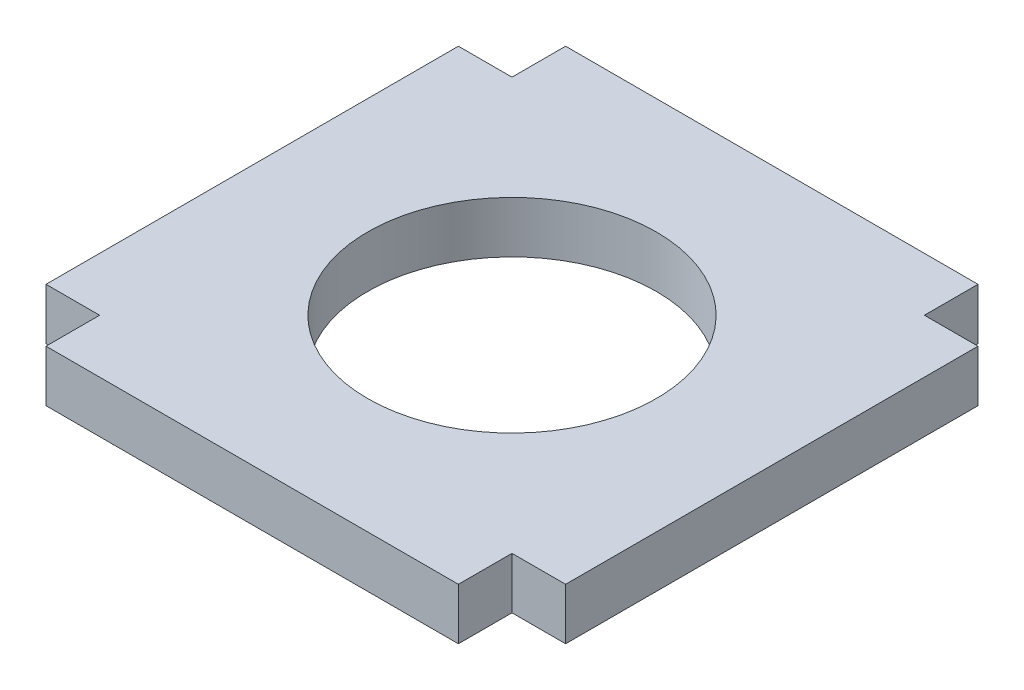
ISO-10303-21;
HEADER;
FILE_DESCRIPTION(('STEP AP214'),'2;1');
FILE_NAME('part.step','',(''),(''),'','','');
FILE_SCHEMA(('AUTOMOTIVE_DESIGN { 1 0 10303 214 1 1 1 1 }'));
ENDSEC;
DATA;
#1=APPLICATION_CONTEXT('core data for automotive mechanical design processes');
#2=APPLICATION_PROTOCOL_DEFINITION('international standard','automotive_design',2000,#1);
#3=PRODUCT_CONTEXT('',#1,'mechanical');
#4=PRODUCT('Part','Part','',(#3));
#5=PRODUCT_RELATED_PRODUCT_CATEGORY('part','',(#4));
#6=PRODUCT_DEFINITION_FORMATION('','',#4);
#7=PRODUCT_DEFINITION_CONTEXT('part definition',#1,'design');
#8=PRODUCT_DEFINITION('design','',#6,#7);
#9=PRODUCT_DEFINITION_SHAPE('','',#8);
#10=(LENGTH_UNIT() NAMED_UNIT(*) SI_UNIT(.MILLI.,.METRE.));
#11=(NAMED_UNIT(*) PLANE_ANGLE_UNIT() SI_UNIT($,.RADIAN.));
#12=(NAMED_UNIT(*) SI_UNIT($,.STERADIAN.) SOLID_ANGLE_UNIT());
#13=UNCERTAINTY_MEASURE_WITH_UNIT(LENGTH_MEASURE(1.E-05),#10,'distance_accuracy_value','');
#14=(GEOMETRIC_REPRESENTATION_CONTEXT(3) GLOBAL_UNCERTAINTY_ASSIGNED_CONTEXT((#13)) GLOBAL_UNIT_ASSIGNED_CONTEXT((#10,
#11,#12)) REPRESENTATION_CONTEXT('',''));
#15=CARTESIAN_POINT('',(0.,0.,0.));
#16=DIRECTION('',(0.,0.,1.));
#17=DIRECTION('',(1.,0.,0.));
#18=AXIS2_PLACEMENT_3D('',#15,#16,#17);
#19=CARTESIAN_POINT('',(0.,0.,0.));
#20=DIRECTION('',(0.,-1.,0.));
#21=DIRECTION('',(0.,0.,-1.));
#22=AXIS2_PLACEMENT_3D('',#19,#20,#21);
#23=PLANE('',#22);
#24=DIRECTION('',(0.,0.,-1.));
#25=VECTOR('',#24,1.);
#26=CARTESIAN_POINT('',(60.8384903341165,0.,0.));
#27=LINE('',#26,#25);
#28=CARTESIAN_POINT('',(60.8384903341165,0.,10.668808797007));
#29=VERTEX_POINT('',#28);
#30=CARTESIAN_POINT('',(60.8384903341166,0.,-14.731191202993));
#31=VERTEX_POINT('',#30);
#32=EDGE_CURVE('E265',#29,#31,#27,.T.);
#33=ORIENTED_EDGE('',*,*,#32,.F.);
#34=DIRECTION('',(1.,0.,0.));
#35=VECTOR('',#34,1.);
#36=CARTESIAN_POINT('',(0.,0.,10.668808797007));
#37=LINE('',#36,#35);
#38=CARTESIAN_POINT('',(57.5364903341166,0.,10.668808797007));
#39=VERTEX_POINT('',#38);
#40=EDGE_CURVE('E112',#39,#29,#37,.T.);
#41=ORIENTED_EDGE('',*,*,#40,.F.);
#42=DIRECTION('',(0.,0.,1.));
#43=VECTOR('',#42,1.);
#44=CARTESIAN_POINT('',(57.5364903341166,0.,0.));
#45=LINE('',#44,#43);
#46=CARTESIAN_POINT('',(57.5364903341166,0.,13.970808797007));
#47=VERTEX_POINT('',#46);
#48=EDGE_CURVE('E284',#39,#47,#45,.T.);
#49=ORIENTED_EDGE('',*,*,#48,.T.);
#50=DIRECTION('',(-1.,0.,0.));
#51=VECTOR('',#50,1.);
#52=CARTESIAN_POINT('',(0.,0.,13.970808797007));
#53=LINE('',#52,#51);
#54=CARTESIAN_POINT('',(32.1364903341166,0.,13.970808797007));
#55=VERTEX_POINT('',#54);
#56=EDGE_CURVE('E179',#47,#55,#53,.T.);
#57=ORIENTED_EDGE('',*,*,#56,.T.);
#58=DIRECTION('',(0.,0.,1.));
#59=VECTOR('',#58,1.);
#60=CARTESIAN_POINT('',(32.1364903341166,0.,0.));
#61=LINE('',#60,#59);
#62=CARTESIAN_POINT('',(32.1364903341166,0.,10.668808797007));
#63=VERTEX_POINT('',#62);
#64=EDGE_CURVE('E154',#63,#55,#61,.T.);
#65=ORIENTED_EDGE('',*,*,#64,.F.);
#66=DIRECTION('',(-1.,0.,0.));
#67=VECTOR('',#66,1.);
#68=CARTESIAN_POINT('',(0.,0.,10.668808797007));
#69=LINE('',#68,#67);
#70=CARTESIAN_POINT('',(28.8344903341166,0.,10.668808797007));
#71=VERTEX_POINT('',#70);
#72=EDGE_CURVE('E277',#63,#71,#69,.T.);
#73=ORIENTED_EDGE('',*,*,#72,.T.);
#74=DIRECTION('',(0.,0.,1.));
#75=VECTOR('',#74,1.);
#76=CARTESIAN_POINT('',(28.8344903341166,0.,0.));
#77=LINE('',#76,#75);
#78=CARTESIAN_POINT('',(28.8344903341166,0.,-14.731191202993));
#79=VERTEX_POINT('',#78);
#80=EDGE_CURVE('E233',#79,#71,#77,.T.);
#81=ORIENTED_EDGE('',*,*,#80,.F.);
#82=DIRECTION('',(-1.,0.,0.));
#83=VECTOR('',#82,1.);
#84=CARTESIAN_POINT('',(0.,0.,-14.731191202993));
#85=LINE('',#84,#83);
#86=CARTESIAN_POINT('',(32.1364903341166,0.,-14.731191202993));
#87=VERTEX_POINT('',#86);
#88=EDGE_CURVE('E209',#87,#79,#85,.T.);
#89=ORIENTED_EDGE('',*,*,#88,.F.);
#90=DIRECTION('',(0.,0.,-1.));
#91=VECTOR('',#90,1.);
#92=CARTESIAN_POINT('',(32.1364903341166,0.,0.));
#93=LINE('',#92,#91);
#94=CARTESIAN_POINT('',(32.1364903341166,0.,-18.033191202993));
#95=VERTEX_POINT('',#94);
#96=EDGE_CURVE('E217',#87,#95,#93,.T.);
#97=ORIENTED_EDGE('',*,*,#96,.T.);
#98=DIRECTION('',(1.,0.,0.));
#99=VECTOR('',#98,1.);
#100=CARTESIAN_POINT('',(0.,0.,-18.033191202993));
#101=LINE('',#100,#99);
#102=CARTESIAN_POINT('',(57.5364903341166,0.,-18.033191202993));
#103=VERTEX_POINT('',#102);
#104=EDGE_CURVE('E272',#95,#103,#101,.T.);
#105=ORIENTED_EDGE('',*,*,#104,.T.);
#106=DIRECTION('',(0.,0.,-1.));
#107=VECTOR('',#106,1.);
#108=CARTESIAN_POINT('',(57.5364903341165,0.,2.41816839510368E-13));
#109=LINE('',#108,#107);
#110=CARTESIAN_POINT('',(57.5364903341166,0.,-14.731191202993));
#111=VERTEX_POINT('',#110);
#112=EDGE_CURVE('E257',#111,#103,#109,.T.);
#113=ORIENTED_EDGE('',*,*,#112,.F.);
#114=DIRECTION('',(1.,0.,0.));
#115=VECTOR('',#114,1.);
#116=CARTESIAN_POINT('',(0.,0.,-14.7311912029927));
#117=LINE('',#116,#115);
#118=EDGE_CURVE('E269',#111,#31,#117,.T.);
#119=ORIENTED_EDGE('',*,*,#118,.T.);
#120=EDGE_LOOP('',(#33,#41,#49,#57,#65,#73,#81,#89,#97,#105,#113,#119));
#121=FACE_BOUND('',#120,.T.);
#122=CARTESIAN_POINT('',(44.8364903341166,0.,-2.03119120299298));
#123=DIRECTION('',(0.,1.,0.));
#124=DIRECTION('',(0.,0.,1.));
#125=AXIS2_PLACEMENT_3D('',#122,#123,#124);
#126=CIRCLE('',#125,8.88999999999999);
#127=CARTESIAN_POINT('',(44.8364903341166,0.,6.85880879700701));
#128=VERTEX_POINT('',#127);
#129=EDGE_CURVE('E98',#128,#128,#126,.T.);
#130=ORIENTED_EDGE('',*,*,#129,.T.);
#131=EDGE_LOOP('',(#130));
#132=FACE_BOUND('',#131,.T.);
#133=ADVANCED_FACE('F94',(#121,#132),#23,.T.);
#134=CARTESIAN_POINT('',(57.5364903341166,0.,0.));
#135=DIRECTION('',(-1.,0.,0.));
#136=DIRECTION('',(0.,0.,1.));
#137=AXIS2_PLACEMENT_3D('',#134,#135,#136);
#138=PLANE('',#137);
#139=DIRECTION('',(0.,1.,0.));
#140=VECTOR('',#139,1.);
#141=CARTESIAN_POINT('',(57.5364903341166,0.,13.970808797007));
#142=LINE('',#141,#140);
#143=CARTESIAN_POINT('',(57.5364903341166,3.175,13.970808797007));
#144=VERTEX_POINT('',#143);
#145=EDGE_CURVE('E238',#47,#144,#142,.T.);
#146=ORIENTED_EDGE('',*,*,#145,.F.);
#147=ORIENTED_EDGE('',*,*,#48,.F.);
#148=DIRECTION('',(0.,1.,0.));
#149=VECTOR('',#148,1.);
#150=CARTESIAN_POINT('',(57.5364903341166,0.,10.668808797007));
#151=LINE('',#150,#149);
#152=CARTESIAN_POINT('',(57.5364903341166,3.175,10.668808797007));
#153=VERTEX_POINT('',#152);
#154=EDGE_CURVE('E242',#39,#153,#151,.T.);
#155=ORIENTED_EDGE('',*,*,#154,.T.);
#156=DIRECTION('',(0.,0.,-1.));
#157=VECTOR('',#156,1.);
#158=CARTESIAN_POINT('',(57.5364903341166,3.175,0.));
#159=LINE('',#158,#157);
#160=EDGE_CURVE('E104',#144,#153,#159,.T.);
#161=ORIENTED_EDGE('',*,*,#160,.F.);
#162=EDGE_LOOP('',(#146,#147,#155,#161));
#163=FACE_BOUND('',#162,.T.);
#164=ADVANCED_FACE('F316',(#163),#138,.F.);
#165=CARTESIAN_POINT('',(0.,0.,13.970808797007));
#166=DIRECTION('',(0.,0.,-1.));
#167=DIRECTION('',(-1.,0.,0.));
#168=AXIS2_PLACEMENT_3D('',#165,#166,#167);
#169=PLANE('',#168);
#170=DIRECTION('',(0.,1.,0.));
#171=VECTOR('',#170,1.);
#172=CARTESIAN_POINT('',(32.1364903341166,0.,13.970808797007));
#173=LINE('',#172,#171);
#174=CARTESIAN_POINT('',(32.1364903341166,3.175,13.970808797007));
#175=VERTEX_POINT('',#174);
#176=EDGE_CURVE('E246',#55,#175,#173,.T.);
#177=ORIENTED_EDGE('',*,*,#176,.F.);
#178=ORIENTED_EDGE('',*,*,#56,.F.);
#179=ORIENTED_EDGE('',*,*,#145,.T.);
#180=DIRECTION('',(1.,0.,0.));
#181=VECTOR('',#180,1.);
#182=CARTESIAN_POINT('',(0.,3.175,13.970808797007));
#183=LINE('',#182,#181);
#184=EDGE_CURVE('E175',#175,#144,#183,.T.);
#185=ORIENTED_EDGE('',*,*,#184,.F.);
#186=EDGE_LOOP('',(#177,#178,#179,#185));
#187=FACE_BOUND('',#186,.T.);
#188=ADVANCED_FACE('F321',(#187),#169,.F.);
#189=CARTESIAN_POINT('',(32.1364903341166,0.,0.));
#190=DIRECTION('',(-1.,0.,0.));
#191=DIRECTION('',(0.,0.,1.));
#192=AXIS2_PLACEMENT_3D('',#189,#190,#191);
#193=PLANE('',#192);
#194=DIRECTION('',(0.,0.,-1.));
#195=VECTOR('',#194,1.);
#196=CARTESIAN_POINT('',(32.1364903341166,3.175,0.));
#197=LINE('',#196,#195);
#198=CARTESIAN_POINT('',(32.1364903341166,3.175,10.668808797007));
#199=VERTEX_POINT('',#198);
#200=EDGE_CURVE('E236',#175,#199,#197,.T.);
#201=ORIENTED_EDGE('',*,*,#200,.T.);
#202=DIRECTION('',(0.,1.,0.));
#203=VECTOR('',#202,1.);
#204=CARTESIAN_POINT('',(32.1364903341166,0.,10.668808797007));
#205=LINE('',#204,#203);
#206=EDGE_CURVE('E234',#63,#199,#205,.T.);
#207=ORIENTED_EDGE('',*,*,#206,.F.);
#208=ORIENTED_EDGE('',*,*,#64,.T.);
#209=ORIENTED_EDGE('',*,*,#176,.T.);
#210=EDGE_LOOP('',(#201,#207,#208,#209));
#211=FACE_BOUND('',#210,.T.);
#212=ADVANCED_FACE('F344',(#211),#193,.T.);
#213=CARTESIAN_POINT('',(0.,0.,10.668808797007));
#214=DIRECTION('',(0.,0.,-1.));
#215=DIRECTION('',(-1.,0.,0.));
#216=AXIS2_PLACEMENT_3D('',#213,#214,#215);
#217=PLANE('',#216);
#218=DIRECTION('',(0.,1.,0.));
#219=VECTOR('',#218,1.);
#220=CARTESIAN_POINT('',(28.8344903341166,0.,10.668808797007));
#221=LINE('',#220,#219);
#222=CARTESIAN_POINT('',(28.8344903341166,3.175,10.668808797007));
#223=VERTEX_POINT('',#222);
#224=EDGE_CURVE('E210',#71,#223,#221,.T.);
#225=ORIENTED_EDGE('',*,*,#224,.F.);
#226=ORIENTED_EDGE('',*,*,#72,.F.);
#227=ORIENTED_EDGE('',*,*,#206,.T.);
#228=DIRECTION('',(1.,0.,0.));
#229=VECTOR('',#228,1.);
#230=CARTESIAN_POINT('',(0.,3.175,10.668808797007));
#231=LINE('',#230,#229);
#232=EDGE_CURVE('E162',#223,#199,#231,.T.);
#233=ORIENTED_EDGE('',*,*,#232,.F.);
#234=EDGE_LOOP('',(#225,#226,#227,#233));
#235=FACE_BOUND('',#234,.T.);
#236=ADVANCED_FACE('F340',(#235),#217,.F.);
#237=CARTESIAN_POINT('',(28.8344903341166,0.,0.));
#238=DIRECTION('',(-1.,0.,0.));
#239=DIRECTION('',(0.,0.,1.));
#240=AXIS2_PLACEMENT_3D('',#237,#238,#239);
#241=PLANE('',#240);
#242=DIRECTION('',(0.,0.,-1.));
#243=VECTOR('',#242,1.);
#244=CARTESIAN_POINT('',(28.8344903341166,3.175,0.));
#245=LINE('',#244,#243);
#246=CARTESIAN_POINT('',(28.8344903341166,3.175,-14.731191202993));
#247=VERTEX_POINT('',#246);
#248=EDGE_CURVE('E232',#223,#247,#245,.T.);
#249=ORIENTED_EDGE('',*,*,#248,.T.);
#250=DIRECTION('',(0.,1.,0.));
#251=VECTOR('',#250,1.);
#252=CARTESIAN_POINT('',(28.8344903341166,0.,-14.731191202993));
#253=LINE('',#252,#251);
#254=EDGE_CURVE('E205',#79,#247,#253,.T.);
#255=ORIENTED_EDGE('',*,*,#254,.F.);
#256=ORIENTED_EDGE('',*,*,#80,.T.);
#257=ORIENTED_EDGE('',*,*,#224,.T.);
#258=EDGE_LOOP('',(#249,#255,#256,#257));
#259=FACE_BOUND('',#258,.T.);
#260=ADVANCED_FACE('F337',(#259),#241,.T.);
#261=CARTESIAN_POINT('',(0.,0.,-14.731191202993));
#262=DIRECTION('',(0.,0.,-1.));
#263=DIRECTION('',(-1.,0.,0.));
#264=AXIS2_PLACEMENT_3D('',#261,#262,#263);
#265=PLANE('',#264);
#266=DIRECTION('',(1.,0.,0.));
#267=VECTOR('',#266,1.);
#268=CARTESIAN_POINT('',(0.,3.175,-14.731191202993));
#269=LINE('',#268,#267);
#270=CARTESIAN_POINT('',(32.1364903341166,3.175,-14.731191202993));
#271=VERTEX_POINT('',#270);
#272=EDGE_CURVE('E199',#247,#271,#269,.T.);
#273=ORIENTED_EDGE('',*,*,#272,.T.);
#274=DIRECTION('',(0.,1.,0.));
#275=VECTOR('',#274,1.);
#276=CARTESIAN_POINT('',(32.1364903341166,0.,-14.731191202993));
#277=LINE('',#276,#275);
#278=EDGE_CURVE('E202',#87,#271,#277,.T.);
#279=ORIENTED_EDGE('',*,*,#278,.F.);
#280=ORIENTED_EDGE('',*,*,#88,.T.);
#281=ORIENTED_EDGE('',*,*,#254,.T.);
#282=EDGE_LOOP('',(#273,#279,#280,#281));
#283=FACE_BOUND('',#282,.T.);
#284=ADVANCED_FACE('F201',(#283),#265,.T.);
#285=CARTESIAN_POINT('',(32.1364903341166,0.,0.));
#286=DIRECTION('',(1.,0.,0.));
#287=DIRECTION('',(0.,0.,-1.));
#288=AXIS2_PLACEMENT_3D('',#285,#286,#287);
#289=PLANE('',#288);
#290=DIRECTION('',(0.,1.,0.));
#291=VECTOR('',#290,1.);
#292=CARTESIAN_POINT('',(32.1364903341166,0.,-18.033191202993));
#293=LINE('',#292,#291);
#294=CARTESIAN_POINT('',(32.1364903341166,3.175,-18.033191202993));
#295=VERTEX_POINT('',#294);
#296=EDGE_CURVE('E219',#95,#295,#293,.T.);
#297=ORIENTED_EDGE('',*,*,#296,.F.);
#298=ORIENTED_EDGE('',*,*,#96,.F.);
#299=ORIENTED_EDGE('',*,*,#278,.T.);
#300=DIRECTION('',(0.,0.,1.));
#301=VECTOR('',#300,1.);
#302=CARTESIAN_POINT('',(32.1364903341166,3.175,0.));
#303=LINE('',#302,#301);
#304=EDGE_CURVE('E214',#295,#271,#303,.T.);
#305=ORIENTED_EDGE('',*,*,#304,.F.);
#306=EDGE_LOOP('',(#297,#298,#299,#305));
#307=FACE_BOUND('',#306,.T.);
#308=ADVANCED_FACE('F213',(#307),#289,.F.);
#309=CARTESIAN_POINT('',(0.,0.,-18.033191202993));
#310=DIRECTION('',(0.,0.,1.));
#311=DIRECTION('',(1.,0.,0.));
#312=AXIS2_PLACEMENT_3D('',#309,#310,#311);
#313=PLANE('',#312);
#314=DIRECTION('',(0.,1.,0.));
#315=VECTOR('',#314,1.);
#316=CARTESIAN_POINT('',(57.5364903341166,0.,-18.033191202993));
#317=LINE('',#316,#315);
#318=CARTESIAN_POINT('',(57.5364903341166,3.175,-18.033191202993));
#319=VERTEX_POINT('',#318);
#320=EDGE_CURVE('E253',#103,#319,#317,.T.);
#321=ORIENTED_EDGE('',*,*,#320,.F.);
#322=ORIENTED_EDGE('',*,*,#104,.F.);
#323=ORIENTED_EDGE('',*,*,#296,.T.);
#324=DIRECTION('',(-1.,0.,0.));
#325=VECTOR('',#324,1.);
#326=CARTESIAN_POINT('',(0.,3.175,-18.033191202993));
#327=LINE('',#326,#325);
#328=EDGE_CURVE('E225',#319,#295,#327,.T.);
#329=ORIENTED_EDGE('',*,*,#328,.F.);
#330=EDGE_LOOP('',(#321,#322,#323,#329));
#331=FACE_BOUND('',#330,.T.);
#332=ADVANCED_FACE('F329',(#331),#313,.F.);
#333=CARTESIAN_POINT('',(57.5364903341165,0.,2.41816839510368E-13));
#334=DIRECTION('',(1.,0.,0.));
#335=DIRECTION('',(0.,0.,-1.));
#336=AXIS2_PLACEMENT_3D('',#333,#334,#335);
#337=PLANE('',#336);
#338=DIRECTION('',(0.,0.,1.));
#339=VECTOR('',#338,1.);
#340=CARTESIAN_POINT('',(57.5364903341165,3.175,2.41816839510368E-13));
#341=LINE('',#340,#339);
#342=CARTESIAN_POINT('',(57.5364903341166,3.175,-14.731191202993));
#343=VERTEX_POINT('',#342);
#344=EDGE_CURVE('E252',#319,#343,#341,.T.);
#345=ORIENTED_EDGE('',*,*,#344,.T.);
#346=DIRECTION('',(0.,1.,0.));
#347=VECTOR('',#346,1.);
#348=CARTESIAN_POINT('',(57.5364903341166,0.,-14.731191202993));
#349=LINE('',#348,#347);
#350=EDGE_CURVE('E256',#111,#343,#349,.T.);
#351=ORIENTED_EDGE('',*,*,#350,.F.);
#352=ORIENTED_EDGE('',*,*,#112,.T.);
#353=ORIENTED_EDGE('',*,*,#320,.T.);
#354=EDGE_LOOP('',(#345,#351,#352,#353));
#355=FACE_BOUND('',#354,.T.);
#356=ADVANCED_FACE('F292',(#355),#337,.T.);
#357=CARTESIAN_POINT('',(0.,0.,-14.7311912029927));
#358=DIRECTION('',(0.,0.,1.));
#359=DIRECTION('',(1.,0.,0.));
#360=AXIS2_PLACEMENT_3D('',#357,#358,#359);
#361=PLANE('',#360);
#362=DIRECTION('',(0.,1.,0.));
#363=VECTOR('',#362,1.);
#364=CARTESIAN_POINT('',(60.8384903341166,0.,-14.731191202993));
#365=LINE('',#364,#363);
#366=CARTESIAN_POINT('',(60.8384903341166,3.175,-14.731191202993));
#367=VERTEX_POINT('',#366);
#368=EDGE_CURVE('E261',#31,#367,#365,.T.);
#369=ORIENTED_EDGE('',*,*,#368,.F.);
#370=ORIENTED_EDGE('',*,*,#118,.F.);
#371=ORIENTED_EDGE('',*,*,#350,.T.);
#372=DIRECTION('',(-1.,0.,0.));
#373=VECTOR('',#372,1.);
#374=CARTESIAN_POINT('',(0.,3.175,-14.7311912029927));
#375=LINE('',#374,#373);
#376=EDGE_CURVE('E228',#367,#343,#375,.T.);
#377=ORIENTED_EDGE('',*,*,#376,.F.);
#378=EDGE_LOOP('',(#369,#370,#371,#377));
#379=FACE_BOUND('',#378,.T.);
#380=ADVANCED_FACE('F297',(#379),#361,.F.);
#381=CARTESIAN_POINT('',(60.8384903341165,0.,0.));
#382=DIRECTION('',(1.,0.,0.));
#383=DIRECTION('',(0.,0.,-1.));
#384=AXIS2_PLACEMENT_3D('',#381,#382,#383);
#385=PLANE('',#384);
#386=DIRECTION('',(0.,0.,1.));
#387=VECTOR('',#386,1.);
#388=CARTESIAN_POINT('',(60.8384903341165,3.175,0.));
#389=LINE('',#388,#387);
#390=CARTESIAN_POINT('',(60.8384903341165,3.175,10.668808797007));
#391=VERTEX_POINT('',#390);
#392=EDGE_CURVE('E260',#367,#391,#389,.T.);
#393=ORIENTED_EDGE('',*,*,#392,.T.);
#394=DIRECTION('',(0.,1.,0.));
#395=VECTOR('',#394,1.);
#396=CARTESIAN_POINT('',(60.8384903341165,0.,10.668808797007));
#397=LINE('',#396,#395);
#398=EDGE_CURVE('E266',#29,#391,#397,.T.);
#399=ORIENTED_EDGE('',*,*,#398,.F.);
#400=ORIENTED_EDGE('',*,*,#32,.T.);
#401=ORIENTED_EDGE('',*,*,#368,.T.);
#402=EDGE_LOOP('',(#393,#399,#400,#401));
#403=FACE_BOUND('',#402,.T.);
#404=ADVANCED_FACE('F301',(#403),#385,.T.);
#405=CARTESIAN_POINT('',(0.,0.,10.668808797007));
#406=DIRECTION('',(0.,0.,1.));
#407=DIRECTION('',(1.,0.,0.));
#408=AXIS2_PLACEMENT_3D('',#405,#406,#407);
#409=PLANE('',#408);
#410=DIRECTION('',(-1.,0.,0.));
#411=VECTOR('',#410,1.);
#412=CARTESIAN_POINT('',(0.,3.175,10.668808797007));
#413=LINE('',#412,#411);
#414=EDGE_CURVE('E264',#391,#153,#413,.T.);
#415=ORIENTED_EDGE('',*,*,#414,.T.);
#416=ORIENTED_EDGE('',*,*,#154,.F.);
#417=ORIENTED_EDGE('',*,*,#40,.T.);
#418=ORIENTED_EDGE('',*,*,#398,.T.);
#419=EDGE_LOOP('',(#415,#416,#417,#418));
#420=FACE_BOUND('',#419,.T.);
#421=ADVANCED_FACE('F303',(#420),#409,.T.);
#422=CARTESIAN_POINT('',(44.8364903341166,0.,-2.03119120299298));
#423=DIRECTION('',(0.,1.,0.));
#424=DIRECTION('',(0.,0.,1.));
#425=AXIS2_PLACEMENT_3D('',#422,#423,#424);
#426=CYLINDRICAL_SURFACE('',#425,8.88999999999999);
#427=ORIENTED_EDGE('',*,*,#129,.F.);
#428=EDGE_LOOP('',(#427));
#429=FACE_BOUND('',#428,.T.);
#430=CARTESIAN_POINT('',(44.8364903341166,3.175,-2.03119120299298));
#431=DIRECTION('',(0.,-1.,0.));
#432=DIRECTION('',(0.,0.,-1.));
#433=AXIS2_PLACEMENT_3D('',#430,#431,#432);
#434=CIRCLE('',#433,8.88999999999999);
#435=CARTESIAN_POINT('',(44.8364903341166,3.175,-10.921191202993));
#436=VERTEX_POINT('',#435);
#437=EDGE_CURVE('E12',#436,#436,#434,.T.);
#438=ORIENTED_EDGE('',*,*,#437,.F.);
#439=EDGE_LOOP('',(#438));
#440=FACE_BOUND('',#439,.T.);
#441=ADVANCED_FACE('F305',(#429,#440),#426,.F.);
#442=CARTESIAN_POINT('',(0.,3.175,0.));
#443=DIRECTION('',(0.,-1.,0.));
#444=DIRECTION('',(0.,0.,-1.));
#445=AXIS2_PLACEMENT_3D('',#442,#443,#444);
#446=PLANE('',#445);
#447=ORIENTED_EDGE('',*,*,#414,.F.);
#448=ORIENTED_EDGE('',*,*,#392,.F.);
#449=ORIENTED_EDGE('',*,*,#376,.T.);
#450=ORIENTED_EDGE('',*,*,#344,.F.);
#451=ORIENTED_EDGE('',*,*,#328,.T.);
#452=ORIENTED_EDGE('',*,*,#304,.T.);
#453=ORIENTED_EDGE('',*,*,#272,.F.);
#454=ORIENTED_EDGE('',*,*,#248,.F.);
#455=ORIENTED_EDGE('',*,*,#232,.T.);
#456=ORIENTED_EDGE('',*,*,#200,.F.);
#457=ORIENTED_EDGE('',*,*,#184,.T.);
#458=ORIENTED_EDGE('',*,*,#160,.T.);
#459=EDGE_LOOP('',(#447,#448,#449,#450,#451,#452,#453,#454,#455,#456,#457,#458));
#460=FACE_BOUND('',#459,.T.);
#461=ORIENTED_EDGE('',*,*,#437,.T.);
#462=EDGE_LOOP('',(#461));
#463=FACE_BOUND('',#462,.T.);
#464=ADVANCED_FACE('F96',(#460,#463),#446,.F.);
#465=CLOSED_SHELL('',(#133,#164,#188,#212,#236,#260,#284,#308,#332,#356,#380,#404,#421,#441,#464));
#466=MANIFOLD_SOLID_BREP('B2',#465);
#467=ADVANCED_BREP_SHAPE_REPRESENTATION('',(#18,#466),#14);
#468=SHAPE_DEFINITION_REPRESENTATION(#9,#467);
ENDSEC;
END-ISO-10303-21;
